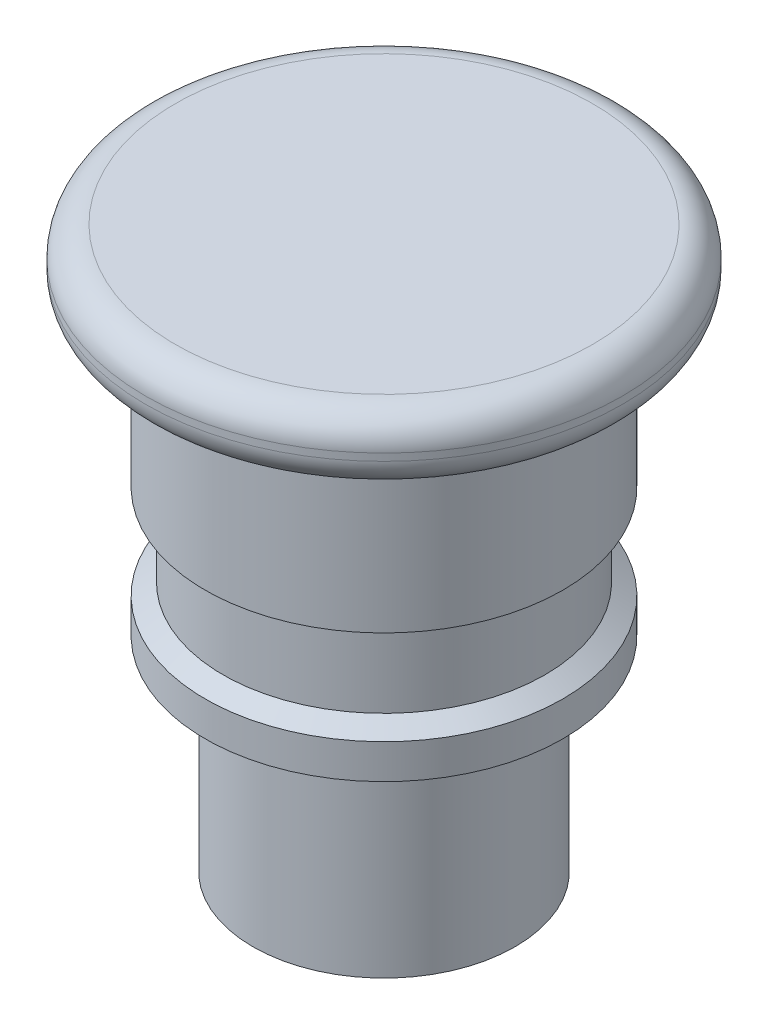
ISO-10303-21;
HEADER;
FILE_DESCRIPTION(('STEP AP214'),'2;1');
FILE_NAME('part.step','',(''),(''),'','','');
FILE_SCHEMA(('AUTOMOTIVE_DESIGN { 1 0 10303 214 1 1 1 1 }'));
ENDSEC;
DATA;
#1=APPLICATION_CONTEXT('core data for automotive mechanical design processes');
#2=APPLICATION_PROTOCOL_DEFINITION('international standard','automotive_design',2000,#1);
#3=PRODUCT_CONTEXT('',#1,'mechanical');
#4=PRODUCT('Part','Part','',(#3));
#5=PRODUCT_RELATED_PRODUCT_CATEGORY('part','',(#4));
#6=PRODUCT_DEFINITION_FORMATION('','',#4);
#7=PRODUCT_DEFINITION_CONTEXT('part definition',#1,'design');
#8=PRODUCT_DEFINITION('design','',#6,#7);
#9=PRODUCT_DEFINITION_SHAPE('','',#8);
#10=(LENGTH_UNIT() NAMED_UNIT(*) SI_UNIT(.MILLI.,.METRE.));
#11=(NAMED_UNIT(*) PLANE_ANGLE_UNIT() SI_UNIT($,.RADIAN.));
#12=(NAMED_UNIT(*) SI_UNIT($,.STERADIAN.) SOLID_ANGLE_UNIT());
#13=UNCERTAINTY_MEASURE_WITH_UNIT(LENGTH_MEASURE(1.E-05),#10,'distance_accuracy_value','');
#14=(GEOMETRIC_REPRESENTATION_CONTEXT(3) GLOBAL_UNCERTAINTY_ASSIGNED_CONTEXT((#13)) GLOBAL_UNIT_ASSIGNED_CONTEXT((#10,
#11,#12)) REPRESENTATION_CONTEXT('',''));
#15=CARTESIAN_POINT('',(0.,0.,0.));
#16=DIRECTION('',(0.,0.,1.));
#17=DIRECTION('',(1.,0.,0.));
#18=AXIS2_PLACEMENT_3D('',#15,#16,#17);
#19=CARTESIAN_POINT('',(0.,29.9,0.));
#20=DIRECTION('',(0.,-1.,0.));
#21=DIRECTION('',(1.,0.,0.));
#22=AXIS2_PLACEMENT_3D('',#19,#20,#21);
#23=PLANE('',#22);
#24=CARTESIAN_POINT('',(0.,29.9,0.));
#25=DIRECTION('',(0.,-1.,0.));
#26=DIRECTION('',(1.,0.,0.));
#27=AXIS2_PLACEMENT_3D('',#24,#25,#26);
#28=CIRCLE('',#27,17.5);
#29=CARTESIAN_POINT('',(17.5,29.9,0.));
#30=VERTEX_POINT('',#29);
#31=EDGE_CURVE('E10',#30,#30,#28,.F.);
#32=ORIENTED_EDGE('',*,*,#31,.T.);
#33=EDGE_LOOP('',(#32));
#34=FACE_BOUND('',#33,.T.);
#35=ADVANCED_FACE('F33',(#34),#23,.F.);
#36=CARTESIAN_POINT('',(0.,11.8460607289315,0.));
#37=DIRECTION('',(0.,1.,0.));
#38=DIRECTION('',(-1.,0.,0.));
#39=AXIS2_PLACEMENT_3D('',#36,#37,#38);
#40=CYLINDRICAL_SURFACE('',#39,20.);
#41=CARTESIAN_POINT('',(0.,26.8,0.));
#42=DIRECTION('',(0.,1.,0.));
#43=DIRECTION('',(-1.,0.,0.));
#44=AXIS2_PLACEMENT_3D('',#41,#42,#43);
#45=CIRCLE('',#44,20.);
#46=CARTESIAN_POINT('',(-20.,26.8,0.));
#47=VERTEX_POINT('',#46);
#48=EDGE_CURVE('E44',#47,#47,#45,.T.);
#49=ORIENTED_EDGE('',*,*,#48,.T.);
#50=EDGE_LOOP('',(#49));
#51=FACE_BOUND('',#50,.T.);
#52=CARTESIAN_POINT('',(0.,27.4,0.));
#53=DIRECTION('',(0.,-1.,0.));
#54=DIRECTION('',(1.,0.,0.));
#55=AXIS2_PLACEMENT_3D('',#52,#53,#54);
#56=CIRCLE('',#55,20.);
#57=CARTESIAN_POINT('',(20.,27.4,0.));
#58=VERTEX_POINT('',#57);
#59=EDGE_CURVE('E48',#58,#58,#56,.T.);
#60=ORIENTED_EDGE('',*,*,#59,.T.);
#61=EDGE_LOOP('',(#60));
#62=FACE_BOUND('',#61,.T.);
#63=ADVANCED_FACE('F93',(#51,#62),#40,.T.);
#64=CARTESIAN_POINT('',(20.,24.3,0.));
#65=DIRECTION('',(0.,1.,0.));
#66=DIRECTION('',(-1.,0.,0.));
#67=AXIS2_PLACEMENT_3D('',#64,#65,#66);
#68=PLANE('',#67);
#69=CARTESIAN_POINT('',(0.,24.3,0.));
#70=DIRECTION('',(0.,1.,0.));
#71=DIRECTION('',(-1.,0.,0.));
#72=AXIS2_PLACEMENT_3D('',#69,#70,#71);
#73=CIRCLE('',#72,17.5);
#74=CARTESIAN_POINT('',(-17.5,24.3,0.));
#75=VERTEX_POINT('',#74);
#76=EDGE_CURVE('E40',#75,#75,#73,.F.);
#77=ORIENTED_EDGE('',*,*,#76,.T.);
#78=EDGE_LOOP('',(#77));
#79=FACE_BOUND('',#78,.T.);
#80=CARTESIAN_POINT('',(0.,24.3,0.));
#81=DIRECTION('',(0.,1.,0.));
#82=DIRECTION('',(-1.,0.,0.));
#83=AXIS2_PLACEMENT_3D('',#80,#81,#82);
#84=CIRCLE('',#83,15.);
#85=CARTESIAN_POINT('',(-15.,24.3,0.));
#86=VERTEX_POINT('',#85);
#87=EDGE_CURVE('E53',#86,#86,#84,.T.);
#88=ORIENTED_EDGE('',*,*,#87,.T.);
#89=EDGE_LOOP('',(#88));
#90=FACE_BOUND('',#89,.T.);
#91=ADVANCED_FACE('F98',(#79,#90),#68,.F.);
#92=CARTESIAN_POINT('',(0.,11.8460607289315,0.));
#93=DIRECTION('',(0.,1.,0.));
#94=DIRECTION('',(-1.,0.,0.));
#95=AXIS2_PLACEMENT_3D('',#92,#93,#94);
#96=CYLINDRICAL_SURFACE('',#95,15.);
#97=ORIENTED_EDGE('',*,*,#87,.F.);
#98=EDGE_LOOP('',(#97));
#99=FACE_BOUND('',#98,.T.);
#100=CARTESIAN_POINT('',(0.,10.8,0.));
#101=DIRECTION('',(0.,1.,0.));
#102=DIRECTION('',(-1.,0.,0.));
#103=AXIS2_PLACEMENT_3D('',#100,#101,#102);
#104=CIRCLE('',#103,15.);
#105=CARTESIAN_POINT('',(-15.,10.8,0.));
#106=VERTEX_POINT('',#105);
#107=EDGE_CURVE('E56',#106,#106,#104,.T.);
#108=ORIENTED_EDGE('',*,*,#107,.T.);
#109=EDGE_LOOP('',(#108));
#110=FACE_BOUND('',#109,.T.);
#111=ADVANCED_FACE('F104',(#99,#110),#96,.T.);
#112=CARTESIAN_POINT('',(15.,10.8,0.));
#113=DIRECTION('',(0.,1.,0.));
#114=DIRECTION('',(-1.,0.,0.));
#115=AXIS2_PLACEMENT_3D('',#112,#113,#114);
#116=PLANE('',#115);
#117=ORIENTED_EDGE('',*,*,#107,.F.);
#118=EDGE_LOOP('',(#117));
#119=FACE_BOUND('',#118,.T.);
#120=CARTESIAN_POINT('',(0.,10.8,0.));
#121=DIRECTION('',(0.,1.,0.));
#122=DIRECTION('',(-1.,0.,0.));
#123=AXIS2_PLACEMENT_3D('',#120,#121,#122);
#124=CIRCLE('',#123,13.5);
#125=CARTESIAN_POINT('',(-13.5,10.8,0.));
#126=VERTEX_POINT('',#125);
#127=EDGE_CURVE('E59',#126,#126,#124,.T.);
#128=ORIENTED_EDGE('',*,*,#127,.T.);
#129=EDGE_LOOP('',(#128));
#130=FACE_BOUND('',#129,.T.);
#131=ADVANCED_FACE('F107',(#119,#130),#116,.F.);
#132=CARTESIAN_POINT('',(0.,11.8460607289315,0.));
#133=DIRECTION('',(0.,1.,0.));
#134=DIRECTION('',(-1.,0.,0.));
#135=AXIS2_PLACEMENT_3D('',#132,#133,#134);
#136=CYLINDRICAL_SURFACE('',#135,13.5);
#137=ORIENTED_EDGE('',*,*,#127,.F.);
#138=EDGE_LOOP('',(#137));
#139=FACE_BOUND('',#138,.T.);
#140=CARTESIAN_POINT('',(0.,3.9,0.));
#141=DIRECTION('',(0.,1.,0.));
#142=DIRECTION('',(-1.,0.,0.));
#143=AXIS2_PLACEMENT_3D('',#140,#141,#142);
#144=CIRCLE('',#143,13.5);
#145=CARTESIAN_POINT('',(-13.5,3.9,0.));
#146=VERTEX_POINT('',#145);
#147=EDGE_CURVE('E62',#146,#146,#144,.T.);
#148=ORIENTED_EDGE('',*,*,#147,.T.);
#149=EDGE_LOOP('',(#148));
#150=FACE_BOUND('',#149,.T.);
#151=ADVANCED_FACE('F111',(#139,#150),#136,.T.);
#152=CARTESIAN_POINT('',(0.,2.9,0.));
#153=DIRECTION('',(0.,-1.,0.));
#154=DIRECTION('',(1.,0.,0.));
#155=AXIS2_PLACEMENT_3D('',#152,#153,#154);
#156=CONICAL_SURFACE('',#155,15.,0.982793723247328);
#157=ORIENTED_EDGE('',*,*,#147,.F.);
#158=EDGE_LOOP('',(#157));
#159=FACE_BOUND('',#158,.T.);
#160=CARTESIAN_POINT('',(0.,2.9,0.));
#161=DIRECTION('',(0.,1.,0.));
#162=DIRECTION('',(-1.,0.,0.));
#163=AXIS2_PLACEMENT_3D('',#160,#161,#162);
#164=CIRCLE('',#163,15.);
#165=CARTESIAN_POINT('',(-15.,2.9,0.));
#166=VERTEX_POINT('',#165);
#167=EDGE_CURVE('E65',#166,#166,#164,.T.);
#168=ORIENTED_EDGE('',*,*,#167,.T.);
#169=EDGE_LOOP('',(#168));
#170=FACE_BOUND('',#169,.T.);
#171=ADVANCED_FACE('F115',(#159,#170),#156,.T.);
#172=CARTESIAN_POINT('',(0.,11.8460607289315,0.));
#173=DIRECTION('',(0.,1.,0.));
#174=DIRECTION('',(-1.,0.,0.));
#175=AXIS2_PLACEMENT_3D('',#172,#173,#174);
#176=CYLINDRICAL_SURFACE('',#175,15.);
#177=ORIENTED_EDGE('',*,*,#167,.F.);
#178=EDGE_LOOP('',(#177));
#179=FACE_BOUND('',#178,.T.);
#180=CARTESIAN_POINT('',(0.,0.,0.));
#181=DIRECTION('',(0.,1.,0.));
#182=DIRECTION('',(-1.,0.,0.));
#183=AXIS2_PLACEMENT_3D('',#180,#181,#182);
#184=CIRCLE('',#183,15.);
#185=CARTESIAN_POINT('',(-15.,0.,0.));
#186=VERTEX_POINT('',#185);
#187=EDGE_CURVE('E68',#186,#186,#184,.T.);
#188=ORIENTED_EDGE('',*,*,#187,.T.);
#189=EDGE_LOOP('',(#188));
#190=FACE_BOUND('',#189,.T.);
#191=ADVANCED_FACE('F119',(#179,#190),#176,.T.);
#192=CARTESIAN_POINT('',(15.,0.,0.));
#193=DIRECTION('',(0.,1.,0.));
#194=DIRECTION('',(-1.,0.,0.));
#195=AXIS2_PLACEMENT_3D('',#192,#193,#194);
#196=PLANE('',#195);
#197=ORIENTED_EDGE('',*,*,#187,.F.);
#198=EDGE_LOOP('',(#197));
#199=FACE_BOUND('',#198,.T.);
#200=CARTESIAN_POINT('',(0.,0.,0.));
#201=DIRECTION('',(0.,1.,0.));
#202=DIRECTION('',(-1.,0.,0.));
#203=AXIS2_PLACEMENT_3D('',#200,#201,#202);
#204=CIRCLE('',#203,11.);
#205=CARTESIAN_POINT('',(-11.,0.,0.));
#206=VERTEX_POINT('',#205);
#207=EDGE_CURVE('E71',#206,#206,#204,.T.);
#208=ORIENTED_EDGE('',*,*,#207,.T.);
#209=EDGE_LOOP('',(#208));
#210=FACE_BOUND('',#209,.T.);
#211=ADVANCED_FACE('F89',(#199,#210),#196,.F.);
#212=CARTESIAN_POINT('',(0.,11.8460607289315,0.));
#213=DIRECTION('',(0.,1.,0.));
#214=DIRECTION('',(-1.,0.,0.));
#215=AXIS2_PLACEMENT_3D('',#212,#213,#214);
#216=CYLINDRICAL_SURFACE('',#215,11.);
#217=ORIENTED_EDGE('',*,*,#207,.F.);
#218=EDGE_LOOP('',(#217));
#219=FACE_BOUND('',#218,.T.);
#220=CARTESIAN_POINT('',(0.,-17.1,0.));
#221=DIRECTION('',(0.,1.,0.));
#222=DIRECTION('',(-1.,0.,0.));
#223=AXIS2_PLACEMENT_3D('',#220,#221,#222);
#224=CIRCLE('',#223,11.);
#225=CARTESIAN_POINT('',(-11.,-17.1,0.));
#226=VERTEX_POINT('',#225);
#227=EDGE_CURVE('E74',#226,#226,#224,.T.);
#228=ORIENTED_EDGE('',*,*,#227,.T.);
#229=EDGE_LOOP('',(#228));
#230=FACE_BOUND('',#229,.T.);
#231=ADVANCED_FACE('F78',(#219,#230),#216,.T.);
#232=CARTESIAN_POINT('',(11.,-17.1,0.));
#233=DIRECTION('',(0.,1.,0.));
#234=DIRECTION('',(-1.,0.,0.));
#235=AXIS2_PLACEMENT_3D('',#232,#233,#234);
#236=PLANE('',#235);
#237=ORIENTED_EDGE('',*,*,#227,.F.);
#238=EDGE_LOOP('',(#237));
#239=FACE_BOUND('',#238,.T.);
#240=ADVANCED_FACE('F80',(#239),#236,.F.);
#241=CARTESIAN_POINT('',(0.,26.8,0.));
#242=DIRECTION('',(0.,1.,0.));
#243=DIRECTION('',(-1.,0.,0.));
#244=AXIS2_PLACEMENT_3D('',#241,#242,#243);
#245=TOROIDAL_SURFACE('',#244,17.5,2.5);
#246=ORIENTED_EDGE('',*,*,#76,.F.);
#247=EDGE_LOOP('',(#246));
#248=FACE_BOUND('',#247,.T.);
#249=ORIENTED_EDGE('',*,*,#48,.F.);
#250=EDGE_LOOP('',(#249));
#251=FACE_BOUND('',#250,.T.);
#252=ADVANCED_FACE('F82',(#248,#251),#245,.T.);
#253=CARTESIAN_POINT('',(0.,27.4,0.));
#254=DIRECTION('',(0.,-1.,0.));
#255=DIRECTION('',(1.,0.,0.));
#256=AXIS2_PLACEMENT_3D('',#253,#254,#255);
#257=TOROIDAL_SURFACE('',#256,17.5,2.5);
#258=ORIENTED_EDGE('',*,*,#59,.F.);
#259=EDGE_LOOP('',(#258));
#260=FACE_BOUND('',#259,.T.);
#261=ORIENTED_EDGE('',*,*,#31,.F.);
#262=EDGE_LOOP('',(#261));
#263=FACE_BOUND('',#262,.T.);
#264=ADVANCED_FACE('F35',(#260,#263),#257,.T.);
#265=CLOSED_SHELL('',(#35,#63,#91,#111,#131,#151,#171,#191,#211,#231,#240,#252,#264));
#266=MANIFOLD_SOLID_BREP('B2',#265);
#267=ADVANCED_BREP_SHAPE_REPRESENTATION('',(#18,#266),#14);
#268=SHAPE_DEFINITION_REPRESENTATION(#9,#267);
ENDSEC;
END-ISO-10303-21;
